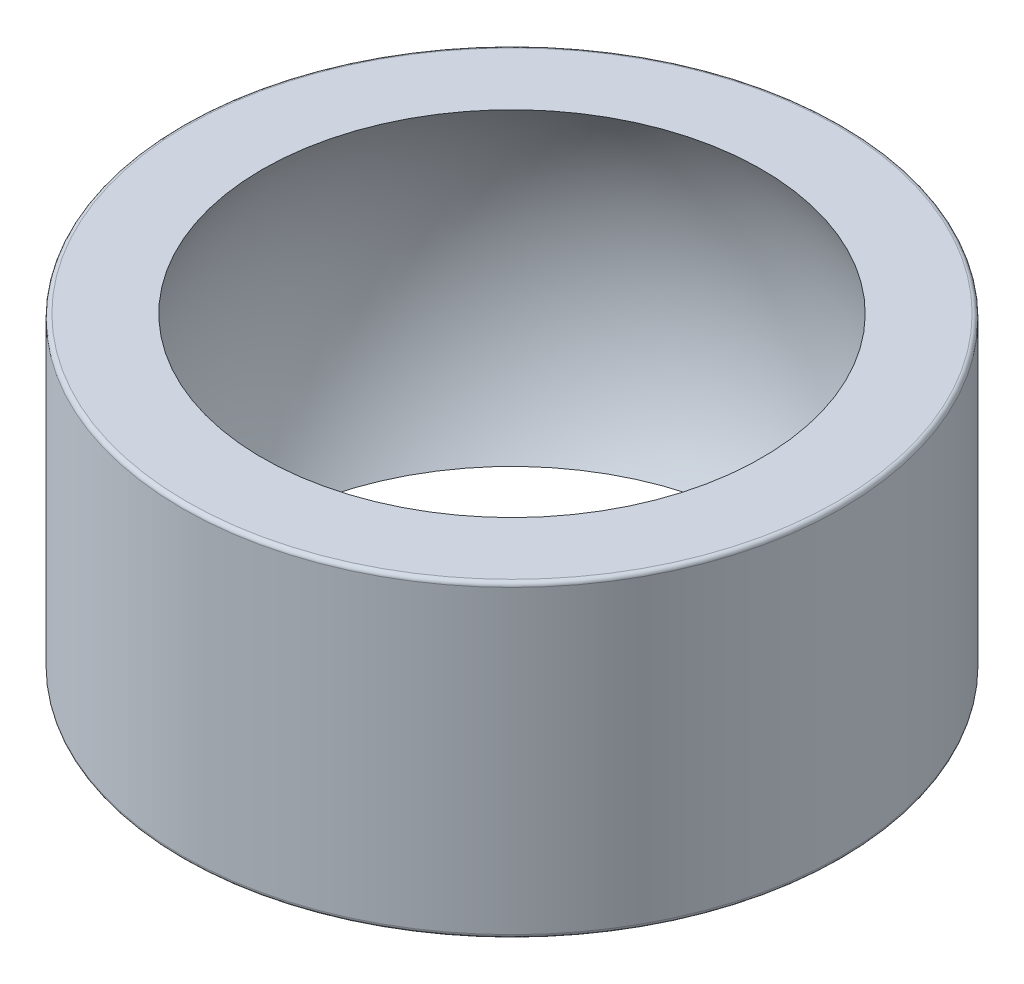
ISO-10303-21;
HEADER;
FILE_DESCRIPTION(('STEP AP214'),'2;1');
FILE_NAME('part.step','',(''),(''),'','','');
FILE_SCHEMA(('AUTOMOTIVE_DESIGN { 1 0 10303 214 1 1 1 1 }'));
ENDSEC;
DATA;
#1=APPLICATION_CONTEXT('core data for automotive mechanical design processes');
#2=APPLICATION_PROTOCOL_DEFINITION('international standard','automotive_design',2000,#1);
#3=PRODUCT_CONTEXT('',#1,'mechanical');
#4=PRODUCT('Part','Part','',(#3));
#5=PRODUCT_RELATED_PRODUCT_CATEGORY('part','',(#4));
#6=PRODUCT_DEFINITION_FORMATION('','',#4);
#7=PRODUCT_DEFINITION_CONTEXT('part definition',#1,'design');
#8=PRODUCT_DEFINITION('design','',#6,#7);
#9=PRODUCT_DEFINITION_SHAPE('','',#8);
#10=(LENGTH_UNIT() NAMED_UNIT(*) SI_UNIT(.MILLI.,.METRE.));
#11=(NAMED_UNIT(*) PLANE_ANGLE_UNIT() SI_UNIT($,.RADIAN.));
#12=(NAMED_UNIT(*) SI_UNIT($,.STERADIAN.) SOLID_ANGLE_UNIT());
#13=UNCERTAINTY_MEASURE_WITH_UNIT(LENGTH_MEASURE(1.E-05),#10,'distance_accuracy_value','');
#14=(GEOMETRIC_REPRESENTATION_CONTEXT(3) GLOBAL_UNCERTAINTY_ASSIGNED_CONTEXT((#13)) GLOBAL_UNIT_ASSIGNED_CONTEXT((#10,
#11,#12)) REPRESENTATION_CONTEXT('',''));
#15=CARTESIAN_POINT('',(0.,0.,0.));
#16=DIRECTION('',(0.,0.,1.));
#17=DIRECTION('',(1.,0.,0.));
#18=AXIS2_PLACEMENT_3D('',#15,#16,#17);
#19=CARTESIAN_POINT('',(0.,7.5,0.));
#20=DIRECTION('',(0.,-1.,0.));
#21=DIRECTION('',(0.,0.,-1.));
#22=AXIS2_PLACEMENT_3D('',#19,#20,#21);
#23=CYLINDRICAL_SURFACE('',#22,16.);
#24=CARTESIAN_POINT('',(0.,-7.3,0.));
#25=DIRECTION('',(0.,1.,0.));
#26=DIRECTION('',(0.,0.,1.));
#27=AXIS2_PLACEMENT_3D('',#24,#25,#26);
#28=CIRCLE('',#27,16.);
#29=CARTESIAN_POINT('',(0.,-7.3,16.));
#30=VERTEX_POINT('',#29);
#31=EDGE_CURVE('E41',#30,#30,#28,.T.);
#32=ORIENTED_EDGE('',*,*,#31,.T.);
#33=EDGE_LOOP('',(#32));
#34=FACE_BOUND('',#33,.T.);
#35=CARTESIAN_POINT('',(0.,7.3,0.));
#36=DIRECTION('',(0.,1.,0.));
#37=DIRECTION('',(0.,0.,1.));
#38=AXIS2_PLACEMENT_3D('',#35,#36,#37);
#39=CIRCLE('',#38,16.);
#40=CARTESIAN_POINT('',(0.,7.3,16.));
#41=VERTEX_POINT('',#40);
#42=EDGE_CURVE('E45',#41,#41,#39,.F.);
#43=ORIENTED_EDGE('',*,*,#42,.T.);
#44=EDGE_LOOP('',(#43));
#45=FACE_BOUND('',#44,.T.);
#46=ADVANCED_FACE('F30',(#34,#45),#23,.T.);
#47=CARTESIAN_POINT('',(0.,7.5,0.));
#48=DIRECTION('',(0.,1.,0.));
#49=DIRECTION('',(0.,0.,1.));
#50=AXIS2_PLACEMENT_3D('',#47,#48,#49);
#51=PLANE('',#50);
#52=CARTESIAN_POINT('',(0.,7.5,0.));
#53=DIRECTION('',(0.,1.,0.));
#54=DIRECTION('',(0.,0.,1.));
#55=AXIS2_PLACEMENT_3D('',#52,#53,#54);
#56=CIRCLE('',#55,15.8);
#57=CARTESIAN_POINT('',(0.,7.5,15.8));
#58=VERTEX_POINT('',#57);
#59=EDGE_CURVE('E10',#58,#58,#56,.T.);
#60=ORIENTED_EDGE('',*,*,#59,.T.);
#61=EDGE_LOOP('',(#60));
#62=FACE_BOUND('',#61,.T.);
#63=CARTESIAN_POINT('',(0.,7.5,0.));
#64=DIRECTION('',(0.,1.,0.));
#65=DIRECTION('',(0.,0.,1.));
#66=AXIS2_PLACEMENT_3D('',#63,#64,#65);
#67=CIRCLE('',#66,12.1283799412782);
#68=CARTESIAN_POINT('',(-12.1283799412782,7.5,0.));
#69=VERTEX_POINT('',#68);
#70=EDGE_CURVE('E50',#69,#69,#67,.T.);
#71=ORIENTED_EDGE('',*,*,#70,.F.);
#72=EDGE_LOOP('',(#71));
#73=FACE_BOUND('',#72,.T.);
#74=ADVANCED_FACE('F60',(#62,#73),#51,.T.);
#75=CARTESIAN_POINT('',(0.,-7.5,0.));
#76=DIRECTION('',(0.,1.,0.));
#77=DIRECTION('',(0.,0.,1.));
#78=AXIS2_PLACEMENT_3D('',#75,#76,#77);
#79=PLANE('',#78);
#80=CARTESIAN_POINT('',(0.,-7.5,0.));
#81=DIRECTION('',(0.,1.,0.));
#82=DIRECTION('',(0.,0.,1.));
#83=AXIS2_PLACEMENT_3D('',#80,#81,#82);
#84=CIRCLE('',#83,15.8);
#85=CARTESIAN_POINT('',(0.,-7.5,15.8));
#86=VERTEX_POINT('',#85);
#87=EDGE_CURVE('E37',#86,#86,#84,.F.);
#88=ORIENTED_EDGE('',*,*,#87,.T.);
#89=EDGE_LOOP('',(#88));
#90=FACE_BOUND('',#89,.T.);
#91=CARTESIAN_POINT('',(0.,-7.5,0.));
#92=DIRECTION('',(0.,1.,0.));
#93=DIRECTION('',(0.,0.,1.));
#94=AXIS2_PLACEMENT_3D('',#91,#92,#93);
#95=CIRCLE('',#94,12.1283799412782);
#96=CARTESIAN_POINT('',(-12.1283799412782,-7.5,0.));
#97=VERTEX_POINT('',#96);
#98=EDGE_CURVE('E51',#97,#97,#95,.T.);
#99=ORIENTED_EDGE('',*,*,#98,.T.);
#100=EDGE_LOOP('',(#99));
#101=FACE_BOUND('',#100,.T.);
#102=ADVANCED_FACE('F62',(#90,#101),#79,.F.);
#103=CARTESIAN_POINT('',(0.,0.,0.));
#104=DIRECTION('',(0.,-1.,0.));
#105=DIRECTION('',(-1.,0.,0.));
#106=AXIS2_PLACEMENT_3D('',#103,#104,#105);
#107=SPHERICAL_SURFACE('',#106,14.26);
#108=CARTESIAN_POINT('',(-12.1283799412782,7.5,0.));
#109=CARTESIAN_POINT('',(-12.2149166015903,7.36006239552259,0.));
#110=CARTESIAN_POINT('',(-12.2990292501936,7.21862590656071,0.));
#111=CARTESIAN_POINT('',(-12.4623104263189,6.93292727407521,0.));
#112=CARTESIAN_POINT('',(-12.541478953841,6.78866513055159,0.));
#113=CARTESIAN_POINT('',(-12.6947757901406,6.49748730334984,0.));
#114=CARTESIAN_POINT('',(-12.768904098918,6.3505716196717,0.));
#115=CARTESIAN_POINT('',(-12.9120320254901,6.05426291264155,0.));
#116=CARTESIAN_POINT('',(-12.9810316432847,5.90486988928954,0.));
#117=CARTESIAN_POINT('',(-13.113819434692,5.60378542826246,0.));
#118=CARTESIAN_POINT('',(-13.1776076083048,5.45209399058739,0.));
#119=CARTESIAN_POINT('',(-13.299896115544,5.14659444494916,0.));
#120=CARTESIAN_POINT('',(-13.3583964491705,4.99278633698599,0.));
#121=CARTESIAN_POINT('',(-13.4700391850696,4.68323771318237,0.));
#122=CARTESIAN_POINT('',(-13.5231815873422,4.52749719734192,0.));
#123=CARTESIAN_POINT('',(-13.6240447962875,4.21427033994497,0.));
#124=CARTESIAN_POINT('',(-13.6717656029602,4.05678399838847,0.));
#125=CARTESIAN_POINT('',(-13.7617284494797,3.74025416201225,0.));
#126=CARTESIAN_POINT('',(-13.8039704893265,3.58121066719252,0.));
#127=CARTESIAN_POINT('',(-13.8829251952601,3.26175706258832,0.));
#128=CARTESIAN_POINT('',(-13.9196378613468,3.10134695280385,0.));
#129=CARTESIAN_POINT('',(-13.987489837002,2.77935229371881,0.));
#130=CARTESIAN_POINT('',(-14.0186291465703,2.61776774441825,0.));
#131=CARTESIAN_POINT('',(-14.0752971034978,2.29361778878277,0.));
#132=CARTESIAN_POINT('',(-14.1008257508569,2.13105238244786,0.));
#133=CARTESIAN_POINT('',(-14.1462417993826,1.80513547031109,0.));
#134=CARTESIAN_POINT('',(-14.1661292005492,1.64178396450924,0.));
#135=CARTESIAN_POINT('',(-14.2002389310685,1.31449055277528,0.));
#136=CARTESIAN_POINT('',(-14.2144612604213,1.15054864684317,0.));
#137=CARTESIAN_POINT('',(-14.2372238085938,0.822270841499554,0.));
#138=CARTESIAN_POINT('',(-14.2457640274135,0.657934942088049,0.));
#139=CARTESIAN_POINT('',(-14.2571521231166,0.329066028451029,0.));
#140=CARTESIAN_POINT('',(-14.26,0.164533014225515,0.));
#141=CARTESIAN_POINT('',(-14.26,-0.164533014225515,0.));
#142=CARTESIAN_POINT('',(-14.2571521231166,-0.329066028451029,0.));
#143=CARTESIAN_POINT('',(-14.2457640274135,-0.657934942088049,0.));
#144=CARTESIAN_POINT('',(-14.2372238085938,-0.822270841499554,0.));
#145=CARTESIAN_POINT('',(-14.2144612604213,-1.15054864684317,0.));
#146=CARTESIAN_POINT('',(-14.2002389310685,-1.31449055277528,0.));
#147=CARTESIAN_POINT('',(-14.1661292005492,-1.64178396450924,0.));
#148=CARTESIAN_POINT('',(-14.1462417993826,-1.80513547031109,0.));
#149=CARTESIAN_POINT('',(-14.1008257508569,-2.13105238244786,0.));
#150=CARTESIAN_POINT('',(-14.0752971034978,-2.29361778878277,0.));
#151=CARTESIAN_POINT('',(-14.0186291465703,-2.61776774441825,0.));
#152=CARTESIAN_POINT('',(-13.987489837002,-2.77935229371881,0.));
#153=CARTESIAN_POINT('',(-13.9196378613468,-3.10134695280385,0.));
#154=CARTESIAN_POINT('',(-13.8829251952601,-3.26175706258832,0.));
#155=CARTESIAN_POINT('',(-13.8039704893265,-3.58121066719252,0.));
#156=CARTESIAN_POINT('',(-13.7617284494797,-3.74025416201225,0.));
#157=CARTESIAN_POINT('',(-13.6717656029602,-4.05678399838847,0.));
#158=CARTESIAN_POINT('',(-13.6240447962875,-4.21427033994497,0.));
#159=CARTESIAN_POINT('',(-13.5231815873422,-4.52749719734192,0.));
#160=CARTESIAN_POINT('',(-13.4700391850696,-4.68323771318237,0.));
#161=CARTESIAN_POINT('',(-13.3583964491705,-4.99278633698599,0.));
#162=CARTESIAN_POINT('',(-13.299896115544,-5.14659444494916,0.));
#163=CARTESIAN_POINT('',(-13.1776076083048,-5.45209399058739,0.));
#164=CARTESIAN_POINT('',(-13.113819434692,-5.60378542826246,0.));
#165=CARTESIAN_POINT('',(-12.9810316432847,-5.90486988928954,0.));
#166=CARTESIAN_POINT('',(-12.9120320254901,-6.05426291264155,0.));
#167=CARTESIAN_POINT('',(-12.768904098918,-6.3505716196717,0.));
#168=CARTESIAN_POINT('',(-12.6947757901406,-6.49748730334984,0.));
#169=CARTESIAN_POINT('',(-12.541478953841,-6.78866513055159,0.));
#170=CARTESIAN_POINT('',(-12.4623104263189,-6.93292727407521,0.));
#171=CARTESIAN_POINT('',(-12.2990292501936,-7.21862590656071,0.));
#172=CARTESIAN_POINT('',(-12.2149166015903,-7.36006239552259,0.));
#173=CARTESIAN_POINT('',(-12.1283799412782,-7.5,0.));
#174=B_SPLINE_CURVE_WITH_KNOTS('',3,(#108,#109,#110,#111,#112,#113,#114,#115,#116,#117,#118,
#119,#120,#121,#122,#123,#124,#125,#126,#127,#128,#129,#130,#131,#132,#133,#134,#135,#136,#137,
#138,#139,#140,#141,#142,#143,#144,#145,#146,#147,#148,#149,#150,#151,#152,#153,#154,#155,#156,
#157,#158,#159,#160,#161,#162,#163,#164,#165,#166,#167,#168,#169,#170,#171,#172,#173),
.UNSPECIFIED.,.F.,.F.,(4,2,2,2,2,2,2,2,2,2,2,2,2,2,2,2,2,2,2,2,2,2,2,2,2,2,2,2,2,2,2,2,4),(0.,
0.493574405170535,0.98714881034107,1.4807232155116,1.97429762068214,2.46787202585267,
2.96144643102321,3.45502083619374,3.94859524136428,4.44216964653481,4.93574405170535,
5.42931845687588,5.92289286204642,6.41646726721695,6.91004167238748,7.40361607755802,
7.89719048272855,8.39076488789909,8.88433929306962,9.37791369824016,9.87148810341069,
10.3650625085812,10.8586369137518,11.3522113189223,11.8457857240928,12.3393601292634,
12.8329345344339,13.3265089396044,13.820083344775,14.3136577499455,14.807232155116,
15.3008065602866,15.7943809654571),.UNSPECIFIED.);
#175=EDGE_CURVE('BSEAM57',#69,#97,#174,.T.);
#176=ORIENTED_EDGE('',*,*,#70,.T.);
#177=ORIENTED_EDGE('',*,*,#98,.F.);
#178=ORIENTED_EDGE('',*,*,#175,.T.);
#179=ORIENTED_EDGE('',*,*,#175,.F.);
#180=EDGE_LOOP('',(#176,#178,#177,#179));
#181=FACE_BOUND('',#180,.T.);
#182=ADVANCED_FACE('F57',(#181),#107,.F.);
#183=CARTESIAN_POINT('',(0.,-7.3,0.));
#184=DIRECTION('',(0.,1.,0.));
#185=DIRECTION('',(0.,0.,1.));
#186=AXIS2_PLACEMENT_3D('',#183,#184,#185);
#187=TOROIDAL_SURFACE('',#186,15.8,0.2);
#188=ORIENTED_EDGE('',*,*,#87,.F.);
#189=EDGE_LOOP('',(#188));
#190=FACE_BOUND('',#189,.T.);
#191=ORIENTED_EDGE('',*,*,#31,.F.);
#192=EDGE_LOOP('',(#191));
#193=FACE_BOUND('',#192,.T.);
#194=ADVANCED_FACE('F72',(#190,#193),#187,.T.);
#195=CARTESIAN_POINT('',(0.,7.3,0.));
#196=DIRECTION('',(0.,1.,0.));
#197=DIRECTION('',(0.,0.,1.));
#198=AXIS2_PLACEMENT_3D('',#195,#196,#197);
#199=TOROIDAL_SURFACE('',#198,15.8,0.2);
#200=ORIENTED_EDGE('',*,*,#42,.F.);
#201=EDGE_LOOP('',(#200));
#202=FACE_BOUND('',#201,.T.);
#203=ORIENTED_EDGE('',*,*,#59,.F.);
#204=EDGE_LOOP('',(#203));
#205=FACE_BOUND('',#204,.T.);
#206=ADVANCED_FACE('F32',(#202,#205),#199,.T.);
#207=CLOSED_SHELL('',(#46,#74,#102,#182,#194,#206));
#208=MANIFOLD_SOLID_BREP('B2',#207);
#209=ADVANCED_BREP_SHAPE_REPRESENTATION('',(#18,#208),#14);
#210=SHAPE_DEFINITION_REPRESENTATION(#9,#209);
ENDSEC;
END-ISO-10303-21;
